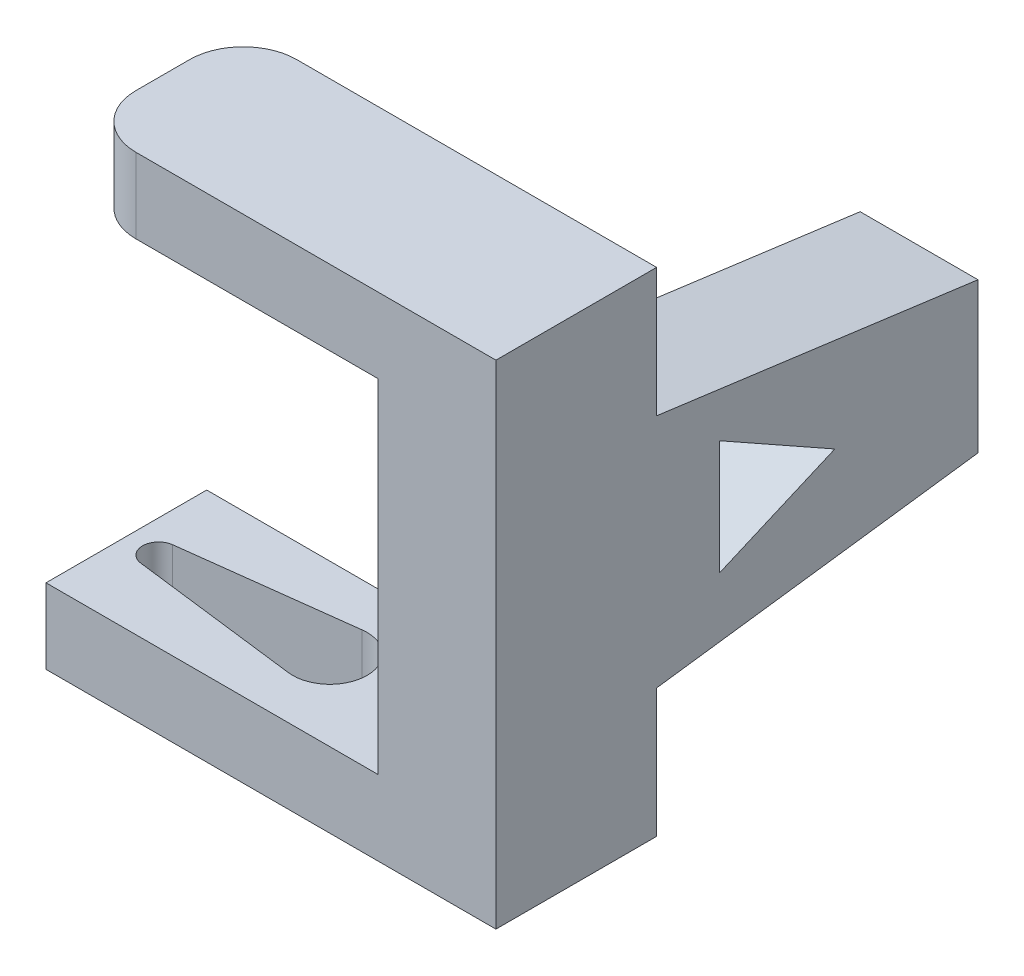
ISO-10303-21;
HEADER;
FILE_DESCRIPTION(('STEP AP214'),'2;1');
FILE_NAME('part.step','',(''),(''),'','','');
FILE_SCHEMA(('AUTOMOTIVE_DESIGN { 1 0 10303 214 1 1 1 1 }'));
ENDSEC;
DATA;
#1=APPLICATION_CONTEXT('core data for automotive mechanical design processes');
#2=APPLICATION_PROTOCOL_DEFINITION('international standard','automotive_design',2000,#1);
#3=PRODUCT_CONTEXT('',#1,'mechanical');
#4=PRODUCT('Part','Part','',(#3));
#5=PRODUCT_RELATED_PRODUCT_CATEGORY('part','',(#4));
#6=PRODUCT_DEFINITION_FORMATION('','',#4);
#7=PRODUCT_DEFINITION_CONTEXT('part definition',#1,'design');
#8=PRODUCT_DEFINITION('design','',#6,#7);
#9=PRODUCT_DEFINITION_SHAPE('','',#8);
#10=(LENGTH_UNIT() NAMED_UNIT(*) SI_UNIT(.MILLI.,.METRE.));
#11=(NAMED_UNIT(*) PLANE_ANGLE_UNIT() SI_UNIT($,.RADIAN.));
#12=(NAMED_UNIT(*) SI_UNIT($,.STERADIAN.) SOLID_ANGLE_UNIT());
#13=UNCERTAINTY_MEASURE_WITH_UNIT(LENGTH_MEASURE(1.E-05),#10,'distance_accuracy_value','');
#14=(GEOMETRIC_REPRESENTATION_CONTEXT(3) GLOBAL_UNCERTAINTY_ASSIGNED_CONTEXT((#13)) GLOBAL_UNIT_ASSIGNED_CONTEXT((#10,
#11,#12)) REPRESENTATION_CONTEXT('',''));
#15=CARTESIAN_POINT('',(0.,0.,0.));
#16=DIRECTION('',(0.,0.,1.));
#17=DIRECTION('',(1.,0.,0.));
#18=AXIS2_PLACEMENT_3D('',#15,#16,#17);
#19=CARTESIAN_POINT('',(0.,-42.,0.));
#20=DIRECTION('',(0.,0.,1.));
#21=DIRECTION('',(1.,0.,0.));
#22=AXIS2_PLACEMENT_3D('',#19,#20,#21);
#23=PLANE('',#22);
#24=DIRECTION('',(0.,1.,0.));
#25=VECTOR('',#24,1.);
#26=CARTESIAN_POINT('',(27.,4.,0.));
#27=LINE('',#26,#25);
#28=CARTESIAN_POINT('',(27.,-7.99999999999999,0.));
#29=VERTEX_POINT('',#28);
#30=CARTESIAN_POINT('',(27.,4.,0.));
#31=VERTEX_POINT('',#30);
#32=EDGE_CURVE('E326',#29,#31,#27,.T.);
#33=ORIENTED_EDGE('',*,*,#32,.F.);
#34=DIRECTION('',(1.,0.,0.));
#35=VECTOR('',#34,1.);
#36=CARTESIAN_POINT('',(23.,-7.99999999999999,0.));
#37=LINE('',#36,#35);
#38=CARTESIAN_POINT('',(16.,-8.,0.));
#39=VERTEX_POINT('',#38);
#40=EDGE_CURVE('E263',#39,#29,#37,.T.);
#41=ORIENTED_EDGE('',*,*,#40,.F.);
#42=DIRECTION('',(0.,1.,0.));
#43=VECTOR('',#42,1.);
#44=CARTESIAN_POINT('',(16.,0.,0.));
#45=LINE('',#44,#43);
#46=CARTESIAN_POINT('',(16.,-3.,0.));
#47=VERTEX_POINT('',#46);
#48=EDGE_CURVE('E300',#39,#47,#45,.T.);
#49=ORIENTED_EDGE('',*,*,#48,.T.);
#50=DIRECTION('',(1.,0.,0.));
#51=VECTOR('',#50,1.);
#52=CARTESIAN_POINT('',(0.,-3.,0.));
#53=LINE('',#52,#51);
#54=CARTESIAN_POINT('',(-6.59433962264147,-3.,0.));
#55=VERTEX_POINT('',#54);
#56=EDGE_CURVE('E294',#55,#47,#53,.T.);
#57=ORIENTED_EDGE('',*,*,#56,.F.);
#58=DIRECTION('',(0.,1.,0.));
#59=VECTOR('',#58,1.);
#60=CARTESIAN_POINT('',(-6.59433962264147,-10.,0.));
#61=LINE('',#60,#59);
#62=CARTESIAN_POINT('',(-6.59433962264147,4.,0.));
#63=VERTEX_POINT('',#62);
#64=EDGE_CURVE('E243',#55,#63,#61,.T.);
#65=ORIENTED_EDGE('',*,*,#64,.T.);
#66=DIRECTION('',(-1.,0.,0.));
#67=VECTOR('',#66,1.);
#68=CARTESIAN_POINT('',(27.,4.,0.));
#69=LINE('',#68,#67);
#70=EDGE_CURVE('E334',#31,#63,#69,.T.);
#71=ORIENTED_EDGE('',*,*,#70,.F.);
#72=EDGE_LOOP('',(#33,#41,#49,#57,#65,#71));
#73=FACE_BOUND('',#72,.T.);
#74=ADVANCED_FACE('F55',(#73),#23,.F.);
#75=DIRECTION('',(-1.,0.,0.));
#76=VECTOR('',#75,1.);
#77=CARTESIAN_POINT('',(23.,-30.,0.));
#78=LINE('',#77,#76);
#79=CARTESIAN_POINT('',(27.,-30.,0.));
#80=VERTEX_POINT('',#79);
#81=CARTESIAN_POINT('',(16.,-30.,0.));
#82=VERTEX_POINT('',#81);
#83=EDGE_CURVE('E268',#80,#82,#78,.T.);
#84=ORIENTED_EDGE('',*,*,#83,.F.);
#85=CARTESIAN_POINT('',(27.,-42.,0.));
#86=VERTEX_POINT('',#85);
#87=EDGE_CURVE('E327',#86,#80,#27,.T.);
#88=ORIENTED_EDGE('',*,*,#87,.F.);
#89=DIRECTION('',(1.,0.,0.));
#90=VECTOR('',#89,1.);
#91=CARTESIAN_POINT('',(0.,-42.,0.));
#92=LINE('',#91,#90);
#93=CARTESIAN_POINT('',(-15.,-42.,0.));
#94=VERTEX_POINT('',#93);
#95=EDGE_CURVE('E339',#94,#86,#92,.T.);
#96=ORIENTED_EDGE('',*,*,#95,.F.);
#97=DIRECTION('',(0.,1.,0.));
#98=VECTOR('',#97,1.);
#99=CARTESIAN_POINT('',(-15.,-42.,0.));
#100=LINE('',#99,#98);
#101=CARTESIAN_POINT('',(-15.,-35.,0.));
#102=VERTEX_POINT('',#101);
#103=EDGE_CURVE('E59',#94,#102,#100,.T.);
#104=ORIENTED_EDGE('',*,*,#103,.T.);
#105=DIRECTION('',(1.,0.,0.));
#106=VECTOR('',#105,1.);
#107=CARTESIAN_POINT('',(0.,-35.,0.));
#108=LINE('',#107,#106);
#109=CARTESIAN_POINT('',(16.,-35.,0.));
#110=VERTEX_POINT('',#109);
#111=EDGE_CURVE('E298',#102,#110,#108,.T.);
#112=ORIENTED_EDGE('',*,*,#111,.T.);
#113=EDGE_CURVE('E303',#110,#82,#45,.T.);
#114=ORIENTED_EDGE('',*,*,#113,.T.);
#115=EDGE_LOOP('',(#84,#88,#96,#104,#112,#114));
#116=FACE_BOUND('',#115,.T.);
#117=ADVANCED_FACE('F362',(#116),#23,.F.);
#118=CARTESIAN_POINT('',(4.,-42.,7.5));
#119=DIRECTION('',(0.,1.,0.));
#120=DIRECTION('',(0.,0.,1.));
#121=AXIS2_PLACEMENT_3D('',#118,#119,#120);
#122=CYLINDRICAL_SURFACE('',#121,3.475);
#123=DIRECTION('',(0.,1.,0.));
#124=VECTOR('',#123,1.);
#125=CARTESIAN_POINT('',(3.57065217391304,-42.,10.9483743190429));
#126=LINE('',#125,#124);
#127=CARTESIAN_POINT('',(3.57065217391304,-42.,10.9483743190429));
#128=VERTEX_POINT('',#127);
#129=CARTESIAN_POINT('',(3.57065217391304,-35.,10.9483743190429));
#130=VERTEX_POINT('',#129);
#131=EDGE_CURVE('E350',#128,#130,#126,.T.);
#132=ORIENTED_EDGE('',*,*,#131,.T.);
#133=CARTESIAN_POINT('',(4.,-35.,7.5));
#134=DIRECTION('',(0.,1.,0.));
#135=DIRECTION('',(0.,0.,1.));
#136=AXIS2_PLACEMENT_3D('',#133,#134,#135);
#137=CIRCLE('',#136,3.475);
#138=CARTESIAN_POINT('',(3.57065217391304,-35.,4.05162568095712));
#139=VERTEX_POINT('',#138);
#140=EDGE_CURVE('E282',#130,#139,#137,.T.);
#141=ORIENTED_EDGE('',*,*,#140,.T.);
#142=DIRECTION('',(0.,1.,0.));
#143=VECTOR('',#142,1.);
#144=CARTESIAN_POINT('',(3.57065217391304,-42.,4.05162568095712));
#145=LINE('',#144,#143);
#146=CARTESIAN_POINT('',(3.57065217391304,-42.,4.05162568095712));
#147=VERTEX_POINT('',#146);
#148=EDGE_CURVE('E12',#147,#139,#145,.T.);
#149=ORIENTED_EDGE('',*,*,#148,.F.);
#150=CARTESIAN_POINT('',(4.,-42.,7.5));
#151=DIRECTION('',(0.,-1.,0.));
#152=DIRECTION('',(0.,0.,-1.));
#153=AXIS2_PLACEMENT_3D('',#150,#151,#152);
#154=CIRCLE('',#153,3.475);
#155=EDGE_CURVE('E343',#128,#147,#154,.F.);
#156=ORIENTED_EDGE('',*,*,#155,.F.);
#157=EDGE_LOOP('',(#132,#141,#149,#156));
#158=FACE_BOUND('',#157,.T.);
#159=ADVANCED_FACE('F386',(#158),#122,.F.);
#160=CARTESIAN_POINT('',(0.551263807155711,-42.,4.4275616181379));
#161=DIRECTION('',(-0.123553331248045,0.,-0.992337933537518));
#162=DIRECTION('',(-0.992337933537518,0.,0.123553331248045));
#163=AXIS2_PLACEMENT_3D('',#160,#161,#162);
#164=PLANE('',#163);
#165=ORIENTED_EDGE('',*,*,#148,.T.);
#166=DIRECTION('',(-0.992337933537518,0.,0.123553331248045));
#167=VECTOR('',#166,1.);
#168=CARTESIAN_POINT('',(-1.28783605402971,-35.,4.65654300307524));
#169=LINE('',#168,#167);
#170=CARTESIAN_POINT('',(-12.1703299968721,-35.,6.01149309969372));
#171=VERTEX_POINT('',#170);
#172=EDGE_CURVE('E277',#139,#171,#169,.T.);
#173=ORIENTED_EDGE('',*,*,#172,.T.);
#174=DIRECTION('',(0.,1.,0.));
#175=VECTOR('',#174,1.);
#176=CARTESIAN_POINT('',(-12.1703299968721,-42.,6.01149309969372));
#177=LINE('',#176,#175);
#178=CARTESIAN_POINT('',(-12.1703299968721,-42.,6.01149309969372));
#179=VERTEX_POINT('',#178);
#180=EDGE_CURVE('E64',#179,#171,#177,.T.);
#181=ORIENTED_EDGE('',*,*,#180,.F.);
#182=DIRECTION('',(-0.992337933537518,0.,0.123553331248045));
#183=VECTOR('',#182,1.);
#184=CARTESIAN_POINT('',(0.551263807155711,-42.,4.4275616181379));
#185=LINE('',#184,#183);
#186=EDGE_CURVE('E345',#147,#179,#185,.T.);
#187=ORIENTED_EDGE('',*,*,#186,.F.);
#188=EDGE_LOOP('',(#165,#173,#181,#187));
#189=FACE_BOUND('',#188,.T.);
#190=ADVANCED_FACE('F378',(#189),#164,.F.);
#191=CARTESIAN_POINT('',(-11.985,-42.,7.5));
#192=DIRECTION('',(0.,1.,0.));
#193=DIRECTION('',(0.,0.,1.));
#194=AXIS2_PLACEMENT_3D('',#191,#192,#193);
#195=CYLINDRICAL_SURFACE('',#194,1.5);
#196=ORIENTED_EDGE('',*,*,#180,.T.);
#197=CARTESIAN_POINT('',(-11.985,-35.,7.5));
#198=DIRECTION('',(0.,1.,0.));
#199=DIRECTION('',(0.,0.,1.));
#200=AXIS2_PLACEMENT_3D('',#197,#198,#199);
#201=CIRCLE('',#200,1.5);
#202=CARTESIAN_POINT('',(-12.1703299968721,-35.,8.98850690030627));
#203=VERTEX_POINT('',#202);
#204=EDGE_CURVE('E288',#171,#203,#201,.T.);
#205=ORIENTED_EDGE('',*,*,#204,.T.);
#206=DIRECTION('',(0.,1.,0.));
#207=VECTOR('',#206,1.);
#208=CARTESIAN_POINT('',(-12.1703299968721,-42.,8.98850690030627));
#209=LINE('',#208,#207);
#210=CARTESIAN_POINT('',(-12.1703299968721,-42.,8.98850690030627));
#211=VERTEX_POINT('',#210);
#212=EDGE_CURVE('E352',#211,#203,#209,.T.);
#213=ORIENTED_EDGE('',*,*,#212,.F.);
#214=CARTESIAN_POINT('',(-11.985,-42.,7.5));
#215=DIRECTION('',(0.,-1.,0.));
#216=DIRECTION('',(0.,0.,-1.));
#217=AXIS2_PLACEMENT_3D('',#214,#215,#216);
#218=CIRCLE('',#217,1.5);
#219=EDGE_CURVE('E77',#179,#211,#218,.F.);
#220=ORIENTED_EDGE('',*,*,#219,.F.);
#221=EDGE_LOOP('',(#196,#205,#213,#220));
#222=FACE_BOUND('',#221,.T.);
#223=ADVANCED_FACE('F370',(#222),#195,.F.);
#224=CARTESIAN_POINT('',(-15.,-42.,0.));
#225=DIRECTION('',(1.,0.,0.));
#226=DIRECTION('',(0.,0.,-1.));
#227=AXIS2_PLACEMENT_3D('',#224,#225,#226);
#228=PLANE('',#227);
#229=DIRECTION('',(0.,1.,0.));
#230=VECTOR('',#229,1.);
#231=CARTESIAN_POINT('',(-15.,-42.,15.));
#232=LINE('',#231,#230);
#233=CARTESIAN_POINT('',(-15.,-42.,15.));
#234=VERTEX_POINT('',#233);
#235=CARTESIAN_POINT('',(-15.,-35.,15.));
#236=VERTEX_POINT('',#235);
#237=EDGE_CURVE('E349',#234,#236,#232,.T.);
#238=ORIENTED_EDGE('',*,*,#237,.T.);
#239=DIRECTION('',(0.,0.,1.));
#240=VECTOR('',#239,1.);
#241=CARTESIAN_POINT('',(-15.,-35.,0.));
#242=LINE('',#241,#240);
#243=EDGE_CURVE('E291',#102,#236,#242,.T.);
#244=ORIENTED_EDGE('',*,*,#243,.F.);
#245=ORIENTED_EDGE('',*,*,#103,.F.);
#246=DIRECTION('',(0.,0.,-1.));
#247=VECTOR('',#246,1.);
#248=CARTESIAN_POINT('',(-15.,-42.,0.));
#249=LINE('',#248,#247);
#250=EDGE_CURVE('E336',#234,#94,#249,.T.);
#251=ORIENTED_EDGE('',*,*,#250,.F.);
#252=EDGE_LOOP('',(#238,#244,#245,#251));
#253=FACE_BOUND('',#252,.T.);
#254=ADVANCED_FACE('F57',(#253),#228,.F.);
#255=CARTESIAN_POINT('',(0.,-42.,15.));
#256=DIRECTION('',(0.,0.,-1.));
#257=DIRECTION('',(-1.,0.,0.));
#258=AXIS2_PLACEMENT_3D('',#255,#256,#257);
#259=PLANE('',#258);
#260=DIRECTION('',(1.,0.,0.));
#261=VECTOR('',#260,1.);
#262=CARTESIAN_POINT('',(0.,-35.,15.));
#263=LINE('',#262,#261);
#264=CARTESIAN_POINT('',(16.,-35.,15.));
#265=VERTEX_POINT('',#264);
#266=EDGE_CURVE('E297',#236,#265,#263,.T.);
#267=ORIENTED_EDGE('',*,*,#266,.F.);
#268=ORIENTED_EDGE('',*,*,#237,.F.);
#269=DIRECTION('',(-1.,0.,0.));
#270=VECTOR('',#269,1.);
#271=CARTESIAN_POINT('',(0.,-42.,15.));
#272=LINE('',#271,#270);
#273=CARTESIAN_POINT('',(27.,-42.,15.));
#274=VERTEX_POINT('',#273);
#275=EDGE_CURVE('E341',#274,#234,#272,.T.);
#276=ORIENTED_EDGE('',*,*,#275,.F.);
#277=DIRECTION('',(0.,-1.,0.));
#278=VECTOR('',#277,1.);
#279=CARTESIAN_POINT('',(27.,4.,15.));
#280=LINE('',#279,#278);
#281=CARTESIAN_POINT('',(27.,4.,15.));
#282=VERTEX_POINT('',#281);
#283=EDGE_CURVE('E320',#282,#274,#280,.T.);
#284=ORIENTED_EDGE('',*,*,#283,.F.);
#285=DIRECTION('',(-1.,0.,0.));
#286=VECTOR('',#285,1.);
#287=CARTESIAN_POINT('',(27.,4.,15.));
#288=LINE('',#287,#286);
#289=CARTESIAN_POINT('',(-6.59433962264147,4.,15.));
#290=VERTEX_POINT('',#289);
#291=EDGE_CURVE('E332',#282,#290,#288,.T.);
#292=ORIENTED_EDGE('',*,*,#291,.T.);
#293=DIRECTION('',(0.,1.,0.));
#294=VECTOR('',#293,1.);
#295=CARTESIAN_POINT('',(-6.59433962264147,-10.,15.));
#296=LINE('',#295,#294);
#297=CARTESIAN_POINT('',(-6.59433962264147,-3.,15.));
#298=VERTEX_POINT('',#297);
#299=EDGE_CURVE('E244',#298,#290,#296,.T.);
#300=ORIENTED_EDGE('',*,*,#299,.F.);
#301=DIRECTION('',(1.,0.,0.));
#302=VECTOR('',#301,1.);
#303=CARTESIAN_POINT('',(0.,-3.,15.));
#304=LINE('',#303,#302);
#305=CARTESIAN_POINT('',(16.,-3.,15.));
#306=VERTEX_POINT('',#305);
#307=EDGE_CURVE('E295',#298,#306,#304,.T.);
#308=ORIENTED_EDGE('',*,*,#307,.T.);
#309=DIRECTION('',(0.,1.,0.));
#310=VECTOR('',#309,1.);
#311=CARTESIAN_POINT('',(16.,-3.,15.));
#312=LINE('',#311,#310);
#313=EDGE_CURVE('E267',#265,#306,#312,.T.);
#314=ORIENTED_EDGE('',*,*,#313,.F.);
#315=EDGE_LOOP('',(#267,#268,#276,#284,#292,#300,#308,#314));
#316=FACE_BOUND('',#315,.T.);
#317=ADVANCED_FACE('F369',(#316),#259,.F.);
#318=CARTESIAN_POINT('',(-1.28783605402971,-42.,10.3434569969248));
#319=DIRECTION('',(-0.123553331248045,0.,0.992337933537518));
#320=DIRECTION('',(0.992337933537518,0.,0.123553331248045));
#321=AXIS2_PLACEMENT_3D('',#318,#319,#320);
#322=PLANE('',#321);
#323=ORIENTED_EDGE('',*,*,#212,.T.);
#324=DIRECTION('',(0.992337933537518,0.,0.123553331248045));
#325=VECTOR('',#324,1.);
#326=CARTESIAN_POINT('',(0.551263807155712,-35.,10.5724383818621));
#327=LINE('',#326,#325);
#328=EDGE_CURVE('E285',#203,#130,#327,.T.);
#329=ORIENTED_EDGE('',*,*,#328,.T.);
#330=ORIENTED_EDGE('',*,*,#131,.F.);
#331=DIRECTION('',(0.992337933537518,0.,0.123553331248045));
#332=VECTOR('',#331,1.);
#333=CARTESIAN_POINT('',(-1.28783605402971,-42.,10.3434569969248));
#334=LINE('',#333,#332);
#335=EDGE_CURVE('E72',#211,#128,#334,.T.);
#336=ORIENTED_EDGE('',*,*,#335,.F.);
#337=EDGE_LOOP('',(#323,#329,#330,#336));
#338=FACE_BOUND('',#337,.T.);
#339=ADVANCED_FACE('F375',(#338),#322,.F.);
#340=CARTESIAN_POINT('',(0.,-42.,0.));
#341=DIRECTION('',(0.,-1.,0.));
#342=DIRECTION('',(0.,0.,-1.));
#343=AXIS2_PLACEMENT_3D('',#340,#341,#342);
#344=PLANE('',#343);
#345=ORIENTED_EDGE('',*,*,#250,.T.);
#346=ORIENTED_EDGE('',*,*,#95,.T.);
#347=DIRECTION('',(0.,0.,-1.));
#348=VECTOR('',#347,1.);
#349=CARTESIAN_POINT('',(27.,-42.,15.));
#350=LINE('',#349,#348);
#351=EDGE_CURVE('E323',#274,#86,#350,.T.);
#352=ORIENTED_EDGE('',*,*,#351,.F.);
#353=ORIENTED_EDGE('',*,*,#275,.T.);
#354=EDGE_LOOP('',(#345,#346,#352,#353));
#355=FACE_BOUND('',#354,.T.);
#356=ORIENTED_EDGE('',*,*,#155,.T.);
#357=ORIENTED_EDGE('',*,*,#186,.T.);
#358=ORIENTED_EDGE('',*,*,#219,.T.);
#359=ORIENTED_EDGE('',*,*,#335,.T.);
#360=EDGE_LOOP('',(#356,#357,#358,#359));
#361=FACE_BOUND('',#360,.T.);
#362=ADVANCED_FACE('F397',(#355,#361),#344,.T.);
#363=CARTESIAN_POINT('',(27.,4.,15.));
#364=DIRECTION('',(0.,-1.,0.));
#365=DIRECTION('',(1.,0.,0.));
#366=AXIS2_PLACEMENT_3D('',#363,#364,#365);
#367=PLANE('',#366);
#368=ORIENTED_EDGE('',*,*,#70,.T.);
#369=CARTESIAN_POINT('',(-6.5943396226415,4.,5.));
#370=DIRECTION('',(0.,1.,0.));
#371=DIRECTION('',(0.,0.,1.));
#372=AXIS2_PLACEMENT_3D('',#369,#370,#371);
#373=CIRCLE('',#372,5.);
#374=CARTESIAN_POINT('',(-11.5943396226415,4.,5.00000000000003));
#375=VERTEX_POINT('',#374);
#376=EDGE_CURVE('E237',#63,#375,#373,.T.);
#377=ORIENTED_EDGE('',*,*,#376,.T.);
#378=DIRECTION('',(0.,0.,1.));
#379=VECTOR('',#378,1.);
#380=CARTESIAN_POINT('',(-11.5943396226415,4.,0.));
#381=LINE('',#380,#379);
#382=CARTESIAN_POINT('',(-11.5943396226415,4.,9.99999999999996));
#383=VERTEX_POINT('',#382);
#384=EDGE_CURVE('E240',#375,#383,#381,.T.);
#385=ORIENTED_EDGE('',*,*,#384,.T.);
#386=CARTESIAN_POINT('',(-6.5943396226415,4.,10.));
#387=DIRECTION('',(0.,1.,0.));
#388=DIRECTION('',(0.,0.,1.));
#389=AXIS2_PLACEMENT_3D('',#386,#387,#388);
#390=CIRCLE('',#389,5.);
#391=EDGE_CURVE('E234',#383,#290,#390,.T.);
#392=ORIENTED_EDGE('',*,*,#391,.T.);
#393=ORIENTED_EDGE('',*,*,#291,.F.);
#394=DIRECTION('',(0.,0.,1.));
#395=VECTOR('',#394,1.);
#396=CARTESIAN_POINT('',(27.,4.,15.));
#397=LINE('',#396,#395);
#398=EDGE_CURVE('E330',#31,#282,#397,.T.);
#399=ORIENTED_EDGE('',*,*,#398,.F.);
#400=EDGE_LOOP('',(#368,#377,#385,#392,#393,#399));
#401=FACE_BOUND('',#400,.T.);
#402=ADVANCED_FACE('F401',(#401),#367,.F.);
#403=CARTESIAN_POINT('',(27.,0.,0.));
#404=DIRECTION('',(1.,0.,0.));
#405=DIRECTION('',(0.,1.,0.));
#406=AXIS2_PLACEMENT_3D('',#403,#404,#405);
#407=PLANE('',#406);
#408=ORIENTED_EDGE('',*,*,#283,.T.);
#409=ORIENTED_EDGE('',*,*,#351,.T.);
#410=ORIENTED_EDGE('',*,*,#87,.T.);
#411=DIRECTION('',(0.,0.132163720091018,-0.991227900682635));
#412=VECTOR('',#411,1.);
#413=CARTESIAN_POINT('',(27.,-30.,0.));
#414=LINE('',#413,#412);
#415=CARTESIAN_POINT('',(27.,-26.,-30.));
#416=VERTEX_POINT('',#415);
#417=EDGE_CURVE('E231',#80,#416,#414,.T.);
#418=ORIENTED_EDGE('',*,*,#417,.T.);
#419=DIRECTION('',(0.,1.,0.));
#420=VECTOR('',#419,1.);
#421=CARTESIAN_POINT('',(27.,-26.,-30.));
#422=LINE('',#421,#420);
#423=CARTESIAN_POINT('',(27.,-12.,-30.));
#424=VERTEX_POINT('',#423);
#425=EDGE_CURVE('E223',#416,#424,#422,.T.);
#426=ORIENTED_EDGE('',*,*,#425,.T.);
#427=DIRECTION('',(0.,0.132163720091018,0.991227900682635));
#428=VECTOR('',#427,1.);
#429=CARTESIAN_POINT('',(27.,-12.,-30.));
#430=LINE('',#429,#428);
#431=EDGE_CURVE('E228',#424,#29,#430,.T.);
#432=ORIENTED_EDGE('',*,*,#431,.T.);
#433=ORIENTED_EDGE('',*,*,#32,.T.);
#434=ORIENTED_EDGE('',*,*,#398,.T.);
#435=EDGE_LOOP('',(#408,#409,#410,#418,#426,#432,#433,#434));
#436=FACE_BOUND('',#435,.T.);
#437=DIRECTION('',(0.,0.489901336978768,0.871777884570614));
#438=VECTOR('',#437,1.);
#439=CARTESIAN_POINT('',(27.,-19.,-16.6315758152868));
#440=LINE('',#439,#438);
#441=CARTESIAN_POINT('',(27.,-19.,-16.6315758152868));
#442=VERTEX_POINT('',#441);
#443=CARTESIAN_POINT('',(27.,-12.9506126039387,-5.86671001677797));
#444=VERTEX_POINT('',#443);
#445=EDGE_CURVE('E204',#442,#444,#440,.T.);
#446=ORIENTED_EDGE('',*,*,#445,.F.);
#447=DIRECTION('',(0.,0.39591636172403,-0.918286575377865));
#448=VECTOR('',#447,1.);
#449=CARTESIAN_POINT('',(27.,-23.6412379486646,-5.86671001677796));
#450=LINE('',#449,#448);
#451=CARTESIAN_POINT('',(27.,-23.6412379486646,-5.86671001677796));
#452=VERTEX_POINT('',#451);
#453=EDGE_CURVE('E214',#452,#442,#450,.T.);
#454=ORIENTED_EDGE('',*,*,#453,.F.);
#455=DIRECTION('',(0.,-1.,0.));
#456=VECTOR('',#455,1.);
#457=CARTESIAN_POINT('',(27.,-12.9506126039387,-5.86671001677797));
#458=LINE('',#457,#456);
#459=EDGE_CURVE('E221',#444,#452,#458,.T.);
#460=ORIENTED_EDGE('',*,*,#459,.F.);
#461=EDGE_LOOP('',(#446,#454,#460));
#462=FACE_BOUND('',#461,.T.);
#463=ADVANCED_FACE('F220',(#436,#462),#407,.T.);
#464=CARTESIAN_POINT('',(0.,-3.,15.));
#465=DIRECTION('',(0.,1.,0.));
#466=DIRECTION('',(0.,0.,1.));
#467=AXIS2_PLACEMENT_3D('',#464,#465,#466);
#468=PLANE('',#467);
#469=CARTESIAN_POINT('',(-6.5943396226415,-3.,10.));
#470=DIRECTION('',(0.,1.,0.));
#471=DIRECTION('',(0.,0.,1.));
#472=AXIS2_PLACEMENT_3D('',#469,#470,#471);
#473=CIRCLE('',#472,5.);
#474=CARTESIAN_POINT('',(-11.5943396226415,-3.,9.99999999999996));
#475=VERTEX_POINT('',#474);
#476=EDGE_CURVE('E251',#475,#298,#473,.T.);
#477=ORIENTED_EDGE('',*,*,#476,.F.);
#478=DIRECTION('',(0.,0.,-1.));
#479=VECTOR('',#478,1.);
#480=CARTESIAN_POINT('',(-11.5943396226415,-3.,15.));
#481=LINE('',#480,#479);
#482=CARTESIAN_POINT('',(-11.5943396226415,-3.,5.));
#483=VERTEX_POINT('',#482);
#484=EDGE_CURVE('E253',#475,#483,#481,.T.);
#485=ORIENTED_EDGE('',*,*,#484,.T.);
#486=CARTESIAN_POINT('',(-6.5943396226415,-3.,5.));
#487=DIRECTION('',(0.,1.,0.));
#488=DIRECTION('',(0.,0.,1.));
#489=AXIS2_PLACEMENT_3D('',#486,#487,#488);
#490=CIRCLE('',#489,5.);
#491=EDGE_CURVE('E247',#55,#483,#490,.T.);
#492=ORIENTED_EDGE('',*,*,#491,.F.);
#493=ORIENTED_EDGE('',*,*,#56,.T.);
#494=DIRECTION('',(0.,0.,1.));
#495=VECTOR('',#494,1.);
#496=CARTESIAN_POINT('',(16.,-3.,-7.));
#497=LINE('',#496,#495);
#498=EDGE_CURVE('E274',#47,#306,#497,.T.);
#499=ORIENTED_EDGE('',*,*,#498,.T.);
#500=ORIENTED_EDGE('',*,*,#307,.F.);
#501=EDGE_LOOP('',(#477,#485,#492,#493,#499,#500));
#502=FACE_BOUND('',#501,.T.);
#503=ADVANCED_FACE('F408',(#502),#468,.F.);
#504=CARTESIAN_POINT('',(-11.5943396226415,-10.,0.));
#505=DIRECTION('',(1.,0.,0.));
#506=DIRECTION('',(0.,0.,-1.));
#507=AXIS2_PLACEMENT_3D('',#504,#505,#506);
#508=PLANE('',#507);
#509=ORIENTED_EDGE('',*,*,#484,.F.);
#510=DIRECTION('',(0.,1.,0.));
#511=VECTOR('',#510,1.);
#512=CARTESIAN_POINT('',(-11.5943396226415,-10.,10.));
#513=LINE('',#512,#511);
#514=EDGE_CURVE('E318',#475,#383,#513,.T.);
#515=ORIENTED_EDGE('',*,*,#514,.T.);
#516=ORIENTED_EDGE('',*,*,#384,.F.);
#517=DIRECTION('',(0.,1.,0.));
#518=VECTOR('',#517,1.);
#519=CARTESIAN_POINT('',(-11.5943396226415,-10.,5.));
#520=LINE('',#519,#518);
#521=EDGE_CURVE('E316',#483,#375,#520,.T.);
#522=ORIENTED_EDGE('',*,*,#521,.F.);
#523=EDGE_LOOP('',(#509,#515,#516,#522));
#524=FACE_BOUND('',#523,.T.);
#525=ADVANCED_FACE('F412',(#524),#508,.F.);
#526=CARTESIAN_POINT('',(16.,-3.,-7.));
#527=DIRECTION('',(1.,0.,0.));
#528=DIRECTION('',(0.,1.,0.));
#529=AXIS2_PLACEMENT_3D('',#526,#527,#528);
#530=PLANE('',#529);
#531=DIRECTION('',(0.,0.489901336978768,0.871777884570614));
#532=VECTOR('',#531,1.);
#533=CARTESIAN_POINT('',(16.,-11.0464438670598,-2.47824775305145));
#534=LINE('',#533,#532);
#535=CARTESIAN_POINT('',(16.,-19.,-16.6315758152868));
#536=VERTEX_POINT('',#535);
#537=CARTESIAN_POINT('',(16.,-12.9506126039387,-5.86671001677797));
#538=VERTEX_POINT('',#537);
#539=EDGE_CURVE('E207',#536,#538,#534,.T.);
#540=ORIENTED_EDGE('',*,*,#539,.T.);
#541=DIRECTION('',(0.,-1.,0.));
#542=VECTOR('',#541,1.);
#543=CARTESIAN_POINT('',(16.,-3.,-5.86671001677797));
#544=LINE('',#543,#542);
#545=CARTESIAN_POINT('',(16.,-23.6412379486646,-5.86671001677797));
#546=VERTEX_POINT('',#545);
#547=EDGE_CURVE('E313',#538,#546,#544,.T.);
#548=ORIENTED_EDGE('',*,*,#547,.T.);
#549=DIRECTION('',(0.,0.39591636172403,-0.918286575377865));
#550=VECTOR('',#549,1.);
#551=CARTESIAN_POINT('',(16.,-19.9937045309448,-14.3267821293547));
#552=LINE('',#551,#550);
#553=EDGE_CURVE('E310',#546,#536,#552,.T.);
#554=ORIENTED_EDGE('',*,*,#553,.T.);
#555=EDGE_LOOP('',(#540,#548,#554));
#556=FACE_BOUND('',#555,.T.);
#557=ORIENTED_EDGE('',*,*,#48,.F.);
#558=DIRECTION('',(0.,-0.132163720091018,-0.991227900682635));
#559=VECTOR('',#558,1.);
#560=CARTESIAN_POINT('',(16.,-8.8296943231441,-6.22270742358079));
#561=LINE('',#560,#559);
#562=CARTESIAN_POINT('',(16.,-12.,-30.));
#563=VERTEX_POINT('',#562);
#564=EDGE_CURVE('E260',#39,#563,#561,.T.);
#565=ORIENTED_EDGE('',*,*,#564,.T.);
#566=DIRECTION('',(0.,1.,0.));
#567=VECTOR('',#566,1.);
#568=CARTESIAN_POINT('',(16.,-30.,-30.));
#569=LINE('',#568,#567);
#570=CARTESIAN_POINT('',(16.,-26.,-30.));
#571=VERTEX_POINT('',#570);
#572=EDGE_CURVE('E264',#571,#563,#569,.T.);
#573=ORIENTED_EDGE('',*,*,#572,.F.);
#574=DIRECTION('',(0.,0.132163720091018,-0.991227900682635));
#575=VECTOR('',#574,1.);
#576=CARTESIAN_POINT('',(16.,-28.6113537117904,-10.4148471615721));
#577=LINE('',#576,#575);
#578=EDGE_CURVE('E256',#82,#571,#577,.T.);
#579=ORIENTED_EDGE('',*,*,#578,.F.);
#580=ORIENTED_EDGE('',*,*,#113,.F.);
#581=DIRECTION('',(0.,0.,1.));
#582=VECTOR('',#581,1.);
#583=CARTESIAN_POINT('',(16.,-35.,-7.));
#584=LINE('',#583,#582);
#585=EDGE_CURVE('E273',#110,#265,#584,.T.);
#586=ORIENTED_EDGE('',*,*,#585,.T.);
#587=ORIENTED_EDGE('',*,*,#313,.T.);
#588=ORIENTED_EDGE('',*,*,#498,.F.);
#589=EDGE_LOOP('',(#557,#565,#573,#579,#580,#586,#587,#588));
#590=FACE_BOUND('',#589,.T.);
#591=ADVANCED_FACE('F419',(#556,#590),#530,.F.);
#592=CARTESIAN_POINT('',(0.,0.,-30.));
#593=DIRECTION('',(0.,0.,1.));
#594=DIRECTION('',(1.,0.,0.));
#595=AXIS2_PLACEMENT_3D('',#592,#593,#594);
#596=PLANE('',#595);
#597=ORIENTED_EDGE('',*,*,#572,.T.);
#598=DIRECTION('',(1.,0.,0.));
#599=VECTOR('',#598,1.);
#600=CARTESIAN_POINT('',(0.,-12.,-30.));
#601=LINE('',#600,#599);
#602=EDGE_CURVE('E308',#563,#424,#601,.T.);
#603=ORIENTED_EDGE('',*,*,#602,.T.);
#604=ORIENTED_EDGE('',*,*,#425,.F.);
#605=DIRECTION('',(1.,0.,0.));
#606=VECTOR('',#605,1.);
#607=CARTESIAN_POINT('',(0.,-26.,-30.));
#608=LINE('',#607,#606);
#609=EDGE_CURVE('E306',#571,#416,#608,.T.);
#610=ORIENTED_EDGE('',*,*,#609,.F.);
#611=EDGE_LOOP('',(#597,#603,#604,#610));
#612=FACE_BOUND('',#611,.T.);
#613=ADVANCED_FACE('F417',(#612),#596,.F.);
#614=CARTESIAN_POINT('',(0.,-35.,15.));
#615=DIRECTION('',(0.,1.,0.));
#616=DIRECTION('',(0.,0.,1.));
#617=AXIS2_PLACEMENT_3D('',#614,#615,#616);
#618=PLANE('',#617);
#619=ORIENTED_EDGE('',*,*,#204,.F.);
#620=ORIENTED_EDGE('',*,*,#172,.F.);
#621=ORIENTED_EDGE('',*,*,#140,.F.);
#622=ORIENTED_EDGE('',*,*,#328,.F.);
#623=EDGE_LOOP('',(#619,#620,#621,#622));
#624=FACE_BOUND('',#623,.T.);
#625=ORIENTED_EDGE('',*,*,#111,.F.);
#626=ORIENTED_EDGE('',*,*,#243,.T.);
#627=ORIENTED_EDGE('',*,*,#266,.T.);
#628=ORIENTED_EDGE('',*,*,#585,.F.);
#629=EDGE_LOOP('',(#625,#626,#627,#628));
#630=FACE_BOUND('',#629,.T.);
#631=ADVANCED_FACE('F366',(#624,#630),#618,.T.);
#632=CARTESIAN_POINT('',(-6.99999999999999,-29.4759825327511,-3.93013100436682));
#633=DIRECTION('',(0.,-0.991227900682635,-0.132163720091018));
#634=DIRECTION('',(0.,0.132163720091018,-0.991227900682635));
#635=AXIS2_PLACEMENT_3D('',#632,#633,#634);
#636=PLANE('',#635);
#637=ORIENTED_EDGE('',*,*,#578,.T.);
#638=ORIENTED_EDGE('',*,*,#609,.T.);
#639=ORIENTED_EDGE('',*,*,#417,.F.);
#640=ORIENTED_EDGE('',*,*,#83,.T.);
#641=EDGE_LOOP('',(#637,#638,#639,#640));
#642=FACE_BOUND('',#641,.T.);
#643=ADVANCED_FACE('F416',(#642),#636,.T.);
#644=CARTESIAN_POINT('',(-7.,-7.86026200873362,1.04803493449782));
#645=DIRECTION('',(0.,-0.991227900682635,0.132163720091018));
#646=DIRECTION('',(0.,-0.132163720091018,-0.991227900682635));
#647=AXIS2_PLACEMENT_3D('',#644,#645,#646);
#648=PLANE('',#647);
#649=ORIENTED_EDGE('',*,*,#40,.T.);
#650=ORIENTED_EDGE('',*,*,#431,.F.);
#651=ORIENTED_EDGE('',*,*,#602,.F.);
#652=ORIENTED_EDGE('',*,*,#564,.F.);
#653=EDGE_LOOP('',(#649,#650,#651,#652));
#654=FACE_BOUND('',#653,.T.);
#655=ADVANCED_FACE('F428',(#654),#648,.F.);
#656=CARTESIAN_POINT('',(-7.,0.,-5.86671001677797));
#657=DIRECTION('',(0.,0.,1.));
#658=DIRECTION('',(1.,0.,0.));
#659=AXIS2_PLACEMENT_3D('',#656,#657,#658);
#660=PLANE('',#659);
#661=DIRECTION('',(1.,0.,0.));
#662=VECTOR('',#661,1.);
#663=CARTESIAN_POINT('',(-7.,-12.9506126039387,-5.86671001677797));
#664=LINE('',#663,#662);
#665=EDGE_CURVE('E210',#538,#444,#664,.T.);
#666=ORIENTED_EDGE('',*,*,#665,.T.);
#667=ORIENTED_EDGE('',*,*,#459,.T.);
#668=DIRECTION('',(1.,0.,0.));
#669=VECTOR('',#668,1.);
#670=CARTESIAN_POINT('',(-7.,-23.6412379486646,-5.86671001677797));
#671=LINE('',#670,#669);
#672=EDGE_CURVE('E211',#546,#452,#671,.T.);
#673=ORIENTED_EDGE('',*,*,#672,.F.);
#674=ORIENTED_EDGE('',*,*,#547,.F.);
#675=EDGE_LOOP('',(#666,#667,#673,#674));
#676=FACE_BOUND('',#675,.T.);
#677=ADVANCED_FACE('F432',(#676),#660,.F.);
#678=CARTESIAN_POINT('',(-7.,-7.33683784874143,4.12298446073246));
#679=DIRECTION('',(0.,0.871777884570614,-0.489901336978768));
#680=DIRECTION('',(0.,0.489901336978768,0.871777884570614));
#681=AXIS2_PLACEMENT_3D('',#678,#679,#680);
#682=PLANE('',#681);
#683=DIRECTION('',(1.,0.,0.));
#684=VECTOR('',#683,1.);
#685=CARTESIAN_POINT('',(-7.,-19.,-16.6315758152868));
#686=LINE('',#685,#684);
#687=EDGE_CURVE('E199',#536,#442,#686,.T.);
#688=ORIENTED_EDGE('',*,*,#687,.T.);
#689=ORIENTED_EDGE('',*,*,#445,.T.);
#690=ORIENTED_EDGE('',*,*,#665,.F.);
#691=ORIENTED_EDGE('',*,*,#539,.F.);
#692=EDGE_LOOP('',(#688,#689,#690,#691));
#693=FACE_BOUND('',#692,.T.);
#694=ADVANCED_FACE('F201',(#693),#682,.F.);
#695=CARTESIAN_POINT('',(-7.,-22.0684079941078,-9.51472452755107));
#696=DIRECTION('',(0.,-0.918286575377865,-0.39591636172403));
#697=DIRECTION('',(0.,0.39591636172403,-0.918286575377865));
#698=AXIS2_PLACEMENT_3D('',#695,#696,#697);
#699=PLANE('',#698);
#700=ORIENTED_EDGE('',*,*,#672,.T.);
#701=ORIENTED_EDGE('',*,*,#453,.T.);
#702=ORIENTED_EDGE('',*,*,#687,.F.);
#703=ORIENTED_EDGE('',*,*,#553,.F.);
#704=EDGE_LOOP('',(#700,#701,#702,#703));
#705=FACE_BOUND('',#704,.T.);
#706=ADVANCED_FACE('F215',(#705),#699,.F.);
#707=CARTESIAN_POINT('',(-6.5943396226415,-10.,5.));
#708=DIRECTION('',(0.,1.,0.));
#709=DIRECTION('',(0.,0.,1.));
#710=AXIS2_PLACEMENT_3D('',#707,#708,#709);
#711=CYLINDRICAL_SURFACE('',#710,5.);
#712=ORIENTED_EDGE('',*,*,#491,.T.);
#713=ORIENTED_EDGE('',*,*,#521,.T.);
#714=ORIENTED_EDGE('',*,*,#376,.F.);
#715=ORIENTED_EDGE('',*,*,#64,.F.);
#716=EDGE_LOOP('',(#712,#713,#714,#715));
#717=FACE_BOUND('',#716,.T.);
#718=ADVANCED_FACE('F439',(#717),#711,.T.);
#719=CARTESIAN_POINT('',(-6.5943396226415,-10.,10.));
#720=DIRECTION('',(0.,1.,0.));
#721=DIRECTION('',(0.,0.,1.));
#722=AXIS2_PLACEMENT_3D('',#719,#720,#721);
#723=CYLINDRICAL_SURFACE('',#722,5.);
#724=ORIENTED_EDGE('',*,*,#476,.T.);
#725=ORIENTED_EDGE('',*,*,#299,.T.);
#726=ORIENTED_EDGE('',*,*,#391,.F.);
#727=ORIENTED_EDGE('',*,*,#514,.F.);
#728=EDGE_LOOP('',(#724,#725,#726,#727));
#729=FACE_BOUND('',#728,.T.);
#730=ADVANCED_FACE('F447',(#729),#723,.T.);
#731=CLOSED_SHELL('',(#74,#117,#159,#190,#223,#254,#317,#339,#362,#402,#463,#503,#525,#591,#613,
#631,#643,#655,#677,#694,#706,#718,#730));
#732=MANIFOLD_SOLID_BREP('B2',#731);
#733=ADVANCED_BREP_SHAPE_REPRESENTATION('',(#18,#732),#14);
#734=SHAPE_DEFINITION_REPRESENTATION(#9,#733);
ENDSEC;
END-ISO-10303-21;
